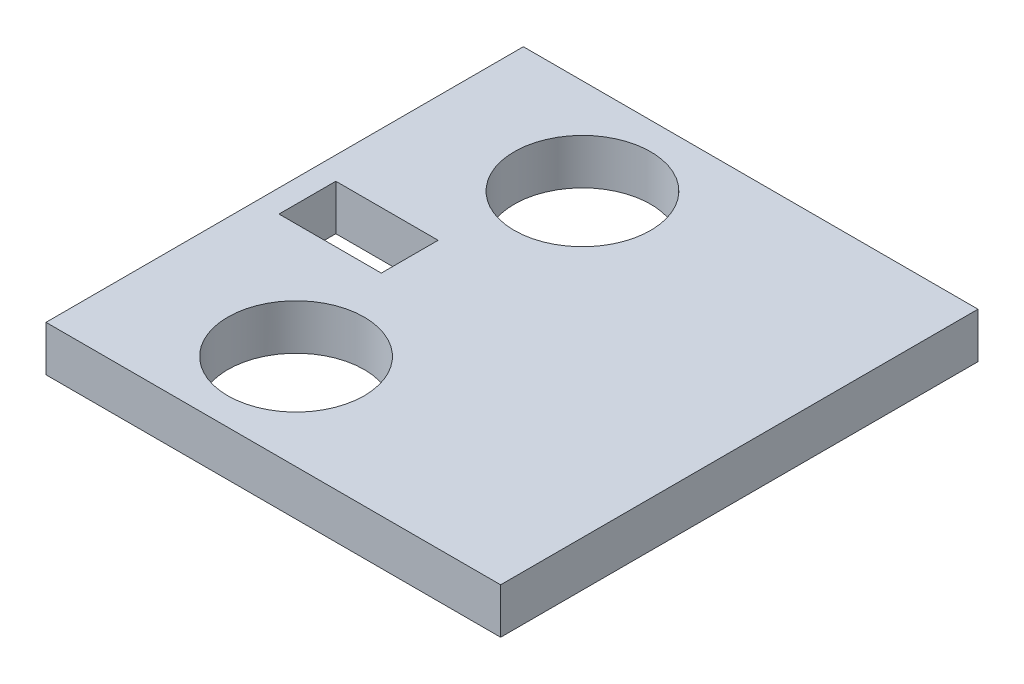
ISO-10303-21;
HEADER;
FILE_DESCRIPTION(('STEP AP214'),'2;1');
FILE_NAME('part.step','',(''),(''),'','','');
FILE_SCHEMA(('AUTOMOTIVE_DESIGN { 1 0 10303 214 1 1 1 1 }'));
ENDSEC;
DATA;
#1=APPLICATION_CONTEXT('core data for automotive mechanical design processes');
#2=APPLICATION_PROTOCOL_DEFINITION('international standard','automotive_design',2000,#1);
#3=PRODUCT_CONTEXT('',#1,'mechanical');
#4=PRODUCT('Part','Part','',(#3));
#5=PRODUCT_RELATED_PRODUCT_CATEGORY('part','',(#4));
#6=PRODUCT_DEFINITION_FORMATION('','',#4);
#7=PRODUCT_DEFINITION_CONTEXT('part definition',#1,'design');
#8=PRODUCT_DEFINITION('design','',#6,#7);
#9=PRODUCT_DEFINITION_SHAPE('','',#8);
#10=(LENGTH_UNIT() NAMED_UNIT(*) SI_UNIT(.MILLI.,.METRE.));
#11=(NAMED_UNIT(*) PLANE_ANGLE_UNIT() SI_UNIT($,.RADIAN.));
#12=(NAMED_UNIT(*) SI_UNIT($,.STERADIAN.) SOLID_ANGLE_UNIT());
#13=UNCERTAINTY_MEASURE_WITH_UNIT(LENGTH_MEASURE(1.E-05),#10,'distance_accuracy_value','');
#14=(GEOMETRIC_REPRESENTATION_CONTEXT(3) GLOBAL_UNCERTAINTY_ASSIGNED_CONTEXT((#13)) GLOBAL_UNIT_ASSIGNED_CONTEXT((#10,
#11,#12)) REPRESENTATION_CONTEXT('',''));
#15=CARTESIAN_POINT('',(0.,0.,0.));
#16=DIRECTION('',(0.,0.,1.));
#17=DIRECTION('',(1.,0.,0.));
#18=AXIS2_PLACEMENT_3D('',#15,#16,#17);
#19=CARTESIAN_POINT('',(0.,10.,0.));
#20=DIRECTION('',(0.,1.,0.));
#21=DIRECTION('',(0.,0.,1.));
#22=AXIS2_PLACEMENT_3D('',#19,#20,#21);
#23=PLANE('',#22);
#24=DIRECTION('',(0.,0.,-1.));
#25=VECTOR('',#24,1.);
#26=CARTESIAN_POINT('',(-45.,10.,6.25));
#27=LINE('',#26,#25);
#28=CARTESIAN_POINT('',(-45.,10.,6.25));
#29=VERTEX_POINT('',#28);
#30=CARTESIAN_POINT('',(-45.,10.,-6.25));
#31=VERTEX_POINT('',#30);
#32=EDGE_CURVE('E116',#29,#31,#27,.T.);
#33=ORIENTED_EDGE('',*,*,#32,.T.);
#34=DIRECTION('',(1.,0.,0.));
#35=VECTOR('',#34,1.);
#36=CARTESIAN_POINT('',(-45.,10.,-6.25));
#37=LINE('',#36,#35);
#38=CARTESIAN_POINT('',(-22.5,10.,-6.25));
#39=VERTEX_POINT('',#38);
#40=EDGE_CURVE('E104',#31,#39,#37,.T.);
#41=ORIENTED_EDGE('',*,*,#40,.T.);
#42=DIRECTION('',(0.,0.,1.));
#43=VECTOR('',#42,1.);
#44=CARTESIAN_POINT('',(-22.5,10.,6.25));
#45=LINE('',#44,#43);
#46=CARTESIAN_POINT('',(-22.5,10.,6.25));
#47=VERTEX_POINT('',#46);
#48=EDGE_CURVE('E130',#39,#47,#45,.T.);
#49=ORIENTED_EDGE('',*,*,#48,.T.);
#50=DIRECTION('',(-1.,0.,0.));
#51=VECTOR('',#50,1.);
#52=CARTESIAN_POINT('',(-45.,10.,6.25));
#53=LINE('',#52,#51);
#54=EDGE_CURVE('E123',#47,#29,#53,.T.);
#55=ORIENTED_EDGE('',*,*,#54,.T.);
#56=EDGE_LOOP('',(#33,#41,#49,#55));
#57=FACE_BOUND('',#56,.T.);
#58=DIRECTION('',(0.,0.,1.));
#59=VECTOR('',#58,1.);
#60=CARTESIAN_POINT('',(-50.,10.,-52.5));
#61=LINE('',#60,#59);
#62=CARTESIAN_POINT('',(-50.,10.,-52.5));
#63=VERTEX_POINT('',#62);
#64=CARTESIAN_POINT('',(-50.,10.,52.5));
#65=VERTEX_POINT('',#64);
#66=EDGE_CURVE('E166',#63,#65,#61,.T.);
#67=ORIENTED_EDGE('',*,*,#66,.T.);
#68=DIRECTION('',(1.,0.,0.));
#69=VECTOR('',#68,1.);
#70=CARTESIAN_POINT('',(-50.,10.,52.5));
#71=LINE('',#70,#69);
#72=CARTESIAN_POINT('',(50.,10.,52.5));
#73=VERTEX_POINT('',#72);
#74=EDGE_CURVE('E170',#65,#73,#71,.T.);
#75=ORIENTED_EDGE('',*,*,#74,.T.);
#76=DIRECTION('',(0.,0.,-1.));
#77=VECTOR('',#76,1.);
#78=CARTESIAN_POINT('',(50.,10.,-52.5));
#79=LINE('',#78,#77);
#80=CARTESIAN_POINT('',(50.,10.,-52.5));
#81=VERTEX_POINT('',#80);
#82=EDGE_CURVE('E174',#73,#81,#79,.T.);
#83=ORIENTED_EDGE('',*,*,#82,.T.);
#84=DIRECTION('',(-1.,0.,0.));
#85=VECTOR('',#84,1.);
#86=CARTESIAN_POINT('',(-50.,10.,-52.5));
#87=LINE('',#86,#85);
#88=EDGE_CURVE('E177',#81,#63,#87,.T.);
#89=ORIENTED_EDGE('',*,*,#88,.T.);
#90=EDGE_LOOP('',(#67,#75,#83,#89));
#91=FACE_BOUND('',#90,.T.);
#92=CARTESIAN_POINT('',(-16.0054354248662,10.,31.5));
#93=DIRECTION('',(0.,1.,0.));
#94=DIRECTION('',(0.,0.,1.));
#95=AXIS2_PLACEMENT_3D('',#92,#93,#94);
#96=CIRCLE('',#95,15.);
#97=CARTESIAN_POINT('',(-16.0054354248662,10.,46.5));
#98=VERTEX_POINT('',#97);
#99=EDGE_CURVE('E157',#98,#98,#96,.F.);
#100=ORIENTED_EDGE('',*,*,#99,.T.);
#101=EDGE_LOOP('',(#100));
#102=FACE_BOUND('',#101,.T.);
#103=CARTESIAN_POINT('',(-16.0054354248662,10.,-31.5));
#104=DIRECTION('',(0.,1.,0.));
#105=DIRECTION('',(0.,0.,1.));
#106=AXIS2_PLACEMENT_3D('',#103,#104,#105);
#107=CIRCLE('',#106,15.);
#108=CARTESIAN_POINT('',(-16.0054354248662,10.,-16.5));
#109=VERTEX_POINT('',#108);
#110=EDGE_CURVE('E153',#109,#109,#107,.T.);
#111=ORIENTED_EDGE('',*,*,#110,.F.);
#112=EDGE_LOOP('',(#111));
#113=FACE_BOUND('',#112,.T.);
#114=ADVANCED_FACE('F39',(#57,#91,#102,#113),#23,.T.);
#115=CARTESIAN_POINT('',(0.,0.,0.));
#116=DIRECTION('',(0.,1.,0.));
#117=DIRECTION('',(0.,0.,1.));
#118=AXIS2_PLACEMENT_3D('',#115,#116,#117);
#119=PLANE('',#118);
#120=DIRECTION('',(1.,0.,0.));
#121=VECTOR('',#120,1.);
#122=CARTESIAN_POINT('',(-45.,0.,-6.25));
#123=LINE('',#122,#121);
#124=CARTESIAN_POINT('',(-45.,0.,-6.25));
#125=VERTEX_POINT('',#124);
#126=CARTESIAN_POINT('',(-22.5,0.,-6.25));
#127=VERTEX_POINT('',#126);
#128=EDGE_CURVE('E128',#125,#127,#123,.T.);
#129=ORIENTED_EDGE('',*,*,#128,.F.);
#130=DIRECTION('',(0.,0.,-1.));
#131=VECTOR('',#130,1.);
#132=CARTESIAN_POINT('',(-45.,0.,6.25));
#133=LINE('',#132,#131);
#134=CARTESIAN_POINT('',(-45.,0.,6.25));
#135=VERTEX_POINT('',#134);
#136=EDGE_CURVE('E63',#135,#125,#133,.T.);
#137=ORIENTED_EDGE('',*,*,#136,.F.);
#138=DIRECTION('',(-1.,0.,0.));
#139=VECTOR('',#138,1.);
#140=CARTESIAN_POINT('',(-45.,0.,6.25));
#141=LINE('',#140,#139);
#142=CARTESIAN_POINT('',(-22.5,0.,6.25));
#143=VERTEX_POINT('',#142);
#144=EDGE_CURVE('E119',#143,#135,#141,.T.);
#145=ORIENTED_EDGE('',*,*,#144,.F.);
#146=DIRECTION('',(0.,0.,1.));
#147=VECTOR('',#146,1.);
#148=CARTESIAN_POINT('',(-22.5,0.,6.25));
#149=LINE('',#148,#147);
#150=EDGE_CURVE('E136',#127,#143,#149,.T.);
#151=ORIENTED_EDGE('',*,*,#150,.F.);
#152=EDGE_LOOP('',(#129,#137,#145,#151));
#153=FACE_BOUND('',#152,.T.);
#154=CARTESIAN_POINT('',(-16.0054354248662,0.,31.5));
#155=DIRECTION('',(0.,-1.,0.));
#156=DIRECTION('',(0.,0.,-1.));
#157=AXIS2_PLACEMENT_3D('',#154,#155,#156);
#158=CIRCLE('',#157,15.);
#159=CARTESIAN_POINT('',(-16.0054354248662,0.,16.5));
#160=VERTEX_POINT('',#159);
#161=EDGE_CURVE('E158',#160,#160,#158,.T.);
#162=ORIENTED_EDGE('',*,*,#161,.F.);
#163=EDGE_LOOP('',(#162));
#164=FACE_BOUND('',#163,.T.);
#165=DIRECTION('',(0.,0.,1.));
#166=VECTOR('',#165,1.);
#167=CARTESIAN_POINT('',(-50.,0.,-52.5));
#168=LINE('',#167,#166);
#169=CARTESIAN_POINT('',(-50.,0.,-52.5));
#170=VERTEX_POINT('',#169);
#171=CARTESIAN_POINT('',(-50.,0.,52.5));
#172=VERTEX_POINT('',#171);
#173=EDGE_CURVE('E162',#170,#172,#168,.T.);
#174=ORIENTED_EDGE('',*,*,#173,.F.);
#175=DIRECTION('',(-1.,0.,0.));
#176=VECTOR('',#175,1.);
#177=CARTESIAN_POINT('',(-50.,0.,-52.5));
#178=LINE('',#177,#176);
#179=CARTESIAN_POINT('',(50.,0.,-52.5));
#180=VERTEX_POINT('',#179);
#181=EDGE_CURVE('E171',#180,#170,#178,.T.);
#182=ORIENTED_EDGE('',*,*,#181,.F.);
#183=DIRECTION('',(0.,0.,-1.));
#184=VECTOR('',#183,1.);
#185=CARTESIAN_POINT('',(50.,0.,-52.5));
#186=LINE('',#185,#184);
#187=CARTESIAN_POINT('',(50.,0.,52.5));
#188=VERTEX_POINT('',#187);
#189=EDGE_CURVE('E187',#188,#180,#186,.T.);
#190=ORIENTED_EDGE('',*,*,#189,.F.);
#191=DIRECTION('',(1.,0.,0.));
#192=VECTOR('',#191,1.);
#193=CARTESIAN_POINT('',(-50.,0.,52.5));
#194=LINE('',#193,#192);
#195=EDGE_CURVE('E184',#172,#188,#194,.T.);
#196=ORIENTED_EDGE('',*,*,#195,.F.);
#197=EDGE_LOOP('',(#174,#182,#190,#196));
#198=FACE_BOUND('',#197,.T.);
#199=CARTESIAN_POINT('',(-16.0054354248662,0.,-31.5));
#200=DIRECTION('',(0.,1.,0.));
#201=DIRECTION('',(0.,0.,1.));
#202=AXIS2_PLACEMENT_3D('',#199,#200,#201);
#203=CIRCLE('',#202,15.);
#204=CARTESIAN_POINT('',(-16.0054354248662,0.,-16.5));
#205=VERTEX_POINT('',#204);
#206=EDGE_CURVE('E112',#205,#205,#203,.T.);
#207=ORIENTED_EDGE('',*,*,#206,.T.);
#208=EDGE_LOOP('',(#207));
#209=FACE_BOUND('',#208,.T.);
#210=ADVANCED_FACE('F210',(#153,#164,#198,#209),#119,.F.);
#211=CARTESIAN_POINT('',(-50.,10.,-52.5));
#212=DIRECTION('',(1.,0.,0.));
#213=DIRECTION('',(0.,0.,-1.));
#214=AXIS2_PLACEMENT_3D('',#211,#212,#213);
#215=PLANE('',#214);
#216=ORIENTED_EDGE('',*,*,#173,.T.);
#217=DIRECTION('',(0.,-1.,0.));
#218=VECTOR('',#217,1.);
#219=CARTESIAN_POINT('',(-50.,10.,52.5));
#220=LINE('',#219,#218);
#221=EDGE_CURVE('E11',#65,#172,#220,.T.);
#222=ORIENTED_EDGE('',*,*,#221,.F.);
#223=ORIENTED_EDGE('',*,*,#66,.F.);
#224=DIRECTION('',(0.,-1.,0.));
#225=VECTOR('',#224,1.);
#226=CARTESIAN_POINT('',(-50.,10.,-52.5));
#227=LINE('',#226,#225);
#228=EDGE_CURVE('E180',#63,#170,#227,.T.);
#229=ORIENTED_EDGE('',*,*,#228,.T.);
#230=EDGE_LOOP('',(#216,#222,#223,#229));
#231=FACE_BOUND('',#230,.T.);
#232=ADVANCED_FACE('F41',(#231),#215,.F.);
#233=CARTESIAN_POINT('',(-50.,10.,52.5));
#234=DIRECTION('',(0.,0.,-1.));
#235=DIRECTION('',(-1.,0.,0.));
#236=AXIS2_PLACEMENT_3D('',#233,#234,#235);
#237=PLANE('',#236);
#238=ORIENTED_EDGE('',*,*,#195,.T.);
#239=DIRECTION('',(0.,-1.,0.));
#240=VECTOR('',#239,1.);
#241=CARTESIAN_POINT('',(50.,10.,52.5));
#242=LINE('',#241,#240);
#243=EDGE_CURVE('E48',#73,#188,#242,.T.);
#244=ORIENTED_EDGE('',*,*,#243,.F.);
#245=ORIENTED_EDGE('',*,*,#74,.F.);
#246=ORIENTED_EDGE('',*,*,#221,.T.);
#247=EDGE_LOOP('',(#238,#244,#245,#246));
#248=FACE_BOUND('',#247,.T.);
#249=ADVANCED_FACE('F220',(#248),#237,.F.);
#250=CARTESIAN_POINT('',(50.,10.,-52.5));
#251=DIRECTION('',(-1.,0.,0.));
#252=DIRECTION('',(0.,0.,1.));
#253=AXIS2_PLACEMENT_3D('',#250,#251,#252);
#254=PLANE('',#253);
#255=ORIENTED_EDGE('',*,*,#189,.T.);
#256=DIRECTION('',(0.,-1.,0.));
#257=VECTOR('',#256,1.);
#258=CARTESIAN_POINT('',(50.,10.,-52.5));
#259=LINE('',#258,#257);
#260=EDGE_CURVE('E195',#81,#180,#259,.T.);
#261=ORIENTED_EDGE('',*,*,#260,.F.);
#262=ORIENTED_EDGE('',*,*,#82,.F.);
#263=ORIENTED_EDGE('',*,*,#243,.T.);
#264=EDGE_LOOP('',(#255,#261,#262,#263));
#265=FACE_BOUND('',#264,.T.);
#266=ADVANCED_FACE('F204',(#265),#254,.F.);
#267=CARTESIAN_POINT('',(-50.,10.,-52.5));
#268=DIRECTION('',(0.,0.,1.));
#269=DIRECTION('',(1.,0.,0.));
#270=AXIS2_PLACEMENT_3D('',#267,#268,#269);
#271=PLANE('',#270);
#272=ORIENTED_EDGE('',*,*,#181,.T.);
#273=ORIENTED_EDGE('',*,*,#228,.F.);
#274=ORIENTED_EDGE('',*,*,#88,.F.);
#275=ORIENTED_EDGE('',*,*,#260,.T.);
#276=EDGE_LOOP('',(#272,#273,#274,#275));
#277=FACE_BOUND('',#276,.T.);
#278=ADVANCED_FACE('F214',(#277),#271,.F.);
#279=CARTESIAN_POINT('',(-16.0054354248662,10.001,31.5));
#280=DIRECTION('',(0.,-1.,0.));
#281=DIRECTION('',(0.,0.,-1.));
#282=AXIS2_PLACEMENT_3D('',#279,#280,#281);
#283=CYLINDRICAL_SURFACE('',#282,15.);
#284=ORIENTED_EDGE('',*,*,#99,.F.);
#285=EDGE_LOOP('',(#284));
#286=FACE_BOUND('',#285,.T.);
#287=ORIENTED_EDGE('',*,*,#161,.T.);
#288=EDGE_LOOP('',(#287));
#289=FACE_BOUND('',#288,.T.);
#290=ADVANCED_FACE('F235',(#286,#289),#283,.F.);
#291=CARTESIAN_POINT('',(-16.0054354248662,10.001,-31.5));
#292=DIRECTION('',(0.,-1.,0.));
#293=DIRECTION('',(0.,0.,-1.));
#294=AXIS2_PLACEMENT_3D('',#291,#292,#293);
#295=CYLINDRICAL_SURFACE('',#294,15.);
#296=ORIENTED_EDGE('',*,*,#110,.T.);
#297=EDGE_LOOP('',(#296));
#298=FACE_BOUND('',#297,.T.);
#299=ORIENTED_EDGE('',*,*,#206,.F.);
#300=EDGE_LOOP('',(#299));
#301=FACE_BOUND('',#300,.T.);
#302=ADVANCED_FACE('F242',(#298,#301),#295,.F.);
#303=CARTESIAN_POINT('',(-45.,10.001,6.25));
#304=DIRECTION('',(-1.,0.,0.));
#305=DIRECTION('',(0.,0.,1.));
#306=AXIS2_PLACEMENT_3D('',#303,#304,#305);
#307=PLANE('',#306);
#308=DIRECTION('',(0.,-1.,0.));
#309=VECTOR('',#308,1.);
#310=CARTESIAN_POINT('',(-45.,10.001,6.25));
#311=LINE('',#310,#309);
#312=EDGE_CURVE('E113',#29,#135,#311,.T.);
#313=ORIENTED_EDGE('',*,*,#312,.T.);
#314=ORIENTED_EDGE('',*,*,#136,.T.);
#315=DIRECTION('',(0.,-1.,0.));
#316=VECTOR('',#315,1.);
#317=CARTESIAN_POINT('',(-45.,10.001,-6.25));
#318=LINE('',#317,#316);
#319=EDGE_CURVE('E106',#31,#125,#318,.T.);
#320=ORIENTED_EDGE('',*,*,#319,.F.);
#321=ORIENTED_EDGE('',*,*,#32,.F.);
#322=EDGE_LOOP('',(#313,#314,#320,#321));
#323=FACE_BOUND('',#322,.T.);
#324=ADVANCED_FACE('F115',(#323),#307,.F.);
#325=CARTESIAN_POINT('',(-45.,10.001,6.25));
#326=DIRECTION('',(0.,0.,1.));
#327=DIRECTION('',(1.,0.,0.));
#328=AXIS2_PLACEMENT_3D('',#325,#326,#327);
#329=PLANE('',#328);
#330=DIRECTION('',(0.,-1.,0.));
#331=VECTOR('',#330,1.);
#332=CARTESIAN_POINT('',(-22.5,10.001,6.25));
#333=LINE('',#332,#331);
#334=EDGE_CURVE('E145',#47,#143,#333,.T.);
#335=ORIENTED_EDGE('',*,*,#334,.T.);
#336=ORIENTED_EDGE('',*,*,#144,.T.);
#337=ORIENTED_EDGE('',*,*,#312,.F.);
#338=ORIENTED_EDGE('',*,*,#54,.F.);
#339=EDGE_LOOP('',(#335,#336,#337,#338));
#340=FACE_BOUND('',#339,.T.);
#341=ADVANCED_FACE('F259',(#340),#329,.F.);
#342=CARTESIAN_POINT('',(-22.5,10.001,6.25));
#343=DIRECTION('',(1.,0.,0.));
#344=DIRECTION('',(0.,0.,-1.));
#345=AXIS2_PLACEMENT_3D('',#342,#343,#344);
#346=PLANE('',#345);
#347=DIRECTION('',(0.,-1.,0.));
#348=VECTOR('',#347,1.);
#349=CARTESIAN_POINT('',(-22.5,10.001,-6.25));
#350=LINE('',#349,#348);
#351=EDGE_CURVE('E55',#39,#127,#350,.T.);
#352=ORIENTED_EDGE('',*,*,#351,.T.);
#353=ORIENTED_EDGE('',*,*,#150,.T.);
#354=ORIENTED_EDGE('',*,*,#334,.F.);
#355=ORIENTED_EDGE('',*,*,#48,.F.);
#356=EDGE_LOOP('',(#352,#353,#354,#355));
#357=FACE_BOUND('',#356,.T.);
#358=ADVANCED_FACE('F264',(#357),#346,.F.);
#359=CARTESIAN_POINT('',(-45.,10.001,-6.25));
#360=DIRECTION('',(0.,0.,-1.));
#361=DIRECTION('',(-1.,0.,0.));
#362=AXIS2_PLACEMENT_3D('',#359,#360,#361);
#363=PLANE('',#362);
#364=ORIENTED_EDGE('',*,*,#319,.T.);
#365=ORIENTED_EDGE('',*,*,#128,.T.);
#366=ORIENTED_EDGE('',*,*,#351,.F.);
#367=ORIENTED_EDGE('',*,*,#40,.F.);
#368=EDGE_LOOP('',(#364,#365,#366,#367));
#369=FACE_BOUND('',#368,.T.);
#370=ADVANCED_FACE('F105',(#369),#363,.F.);
#371=CLOSED_SHELL('',(#114,#210,#232,#249,#266,#278,#290,#302,#324,#341,#358,#370));
#372=MANIFOLD_SOLID_BREP('B2',#371);
#373=ADVANCED_BREP_SHAPE_REPRESENTATION('',(#18,#372),#14);
#374=SHAPE_DEFINITION_REPRESENTATION(#9,#373);
ENDSEC;
END-ISO-10303-21;
